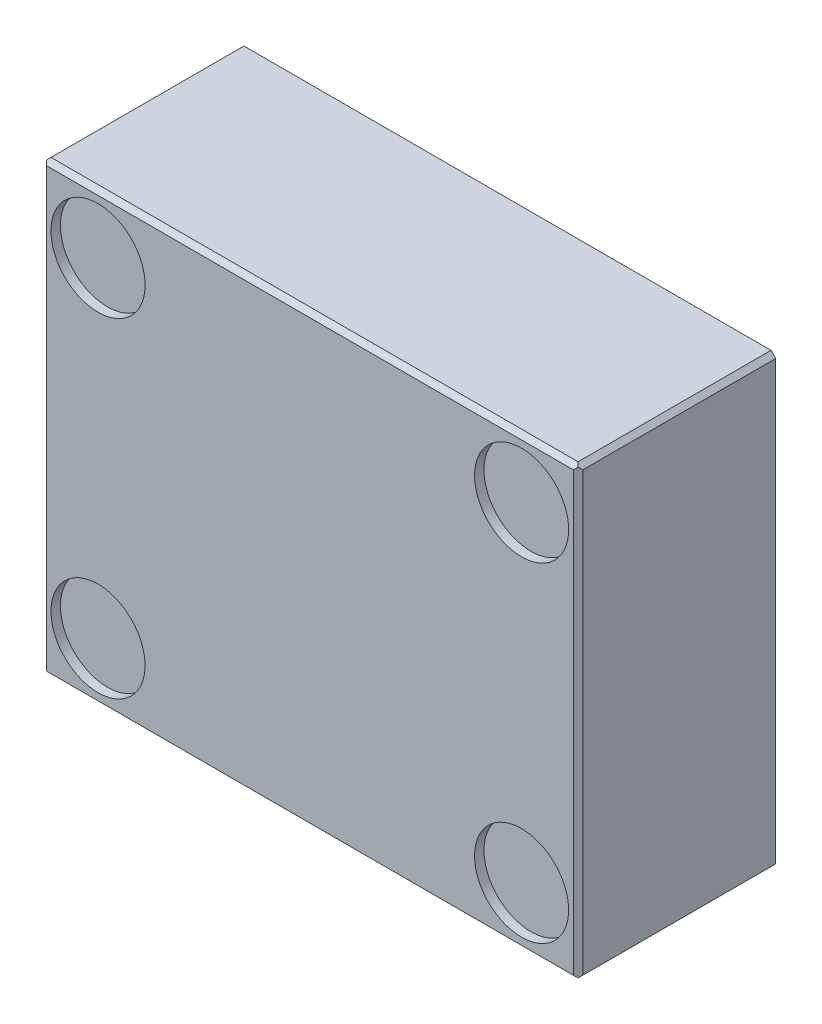
ISO-10303-21;
HEADER;
FILE_DESCRIPTION(('STEP AP214'),'2;1');
FILE_NAME('part.step','',(''),(''),'','','');
FILE_SCHEMA(('AUTOMOTIVE_DESIGN { 1 0 10303 214 1 1 1 1 }'));
ENDSEC;
DATA;
#1=APPLICATION_CONTEXT('core data for automotive mechanical design processes');
#2=APPLICATION_PROTOCOL_DEFINITION('international standard','automotive_design',2000,#1);
#3=PRODUCT_CONTEXT('',#1,'mechanical');
#4=PRODUCT('Part','Part','',(#3));
#5=PRODUCT_RELATED_PRODUCT_CATEGORY('part','',(#4));
#6=PRODUCT_DEFINITION_FORMATION('','',#4);
#7=PRODUCT_DEFINITION_CONTEXT('part definition',#1,'design');
#8=PRODUCT_DEFINITION('design','',#6,#7);
#9=PRODUCT_DEFINITION_SHAPE('','',#8);
#10=(LENGTH_UNIT() NAMED_UNIT(*) SI_UNIT(.MILLI.,.METRE.));
#11=(NAMED_UNIT(*) PLANE_ANGLE_UNIT() SI_UNIT($,.RADIAN.));
#12=(NAMED_UNIT(*) SI_UNIT($,.STERADIAN.) SOLID_ANGLE_UNIT());
#13=UNCERTAINTY_MEASURE_WITH_UNIT(LENGTH_MEASURE(1.E-05),#10,'distance_accuracy_value','');
#14=(GEOMETRIC_REPRESENTATION_CONTEXT(3) GLOBAL_UNCERTAINTY_ASSIGNED_CONTEXT((#13)) GLOBAL_UNIT_ASSIGNED_CONTEXT((#10,
#11,#12)) REPRESENTATION_CONTEXT('',''));
#15=CARTESIAN_POINT('',(0.,0.,0.));
#16=DIRECTION('',(0.,0.,1.));
#17=DIRECTION('',(1.,0.,0.));
#18=AXIS2_PLACEMENT_3D('',#15,#16,#17);
#19=CARTESIAN_POINT('',(-22.5,17.5,21.));
#20=DIRECTION('',(0.,0.,-1.));
#21=DIRECTION('',(-1.,0.,0.));
#22=AXIS2_PLACEMENT_3D('',#19,#20,#21);
#23=CYLINDRICAL_SURFACE('',#22,7.);
#24=DIRECTION('',(0.,0.,-1.));
#25=VECTOR('',#24,1.);
#26=CARTESIAN_POINT('',(-26.4999999999991,11.7554373534613,21.));
#27=LINE('',#26,#25);
#28=CARTESIAN_POINT('',(-26.4999999999995,11.7554373534616,19.));
#29=VERTEX_POINT('',#28);
#30=CARTESIAN_POINT('',(-26.4999999999995,11.7554373534616,18.));
#31=VERTEX_POINT('',#30);
#32=EDGE_CURVE('E188',#29,#31,#27,.T.);
#33=ORIENTED_EDGE('',*,*,#32,.T.);
#34=CARTESIAN_POINT('',(-22.5,17.5,18.));
#35=DIRECTION('',(0.,0.,-1.));
#36=DIRECTION('',(-1.,0.,0.));
#37=AXIS2_PLACEMENT_3D('',#34,#35,#36);
#38=CIRCLE('',#37,7.);
#39=CARTESIAN_POINT('',(-16.9378511346786,21.7500000000004,18.));
#40=VERTEX_POINT('',#39);
#41=EDGE_CURVE('E195',#40,#31,#38,.T.);
#42=ORIENTED_EDGE('',*,*,#41,.F.);
#43=DIRECTION('',(0.,0.,-1.));
#44=VECTOR('',#43,1.);
#45=CARTESIAN_POINT('',(-16.9378511346789,21.7500000000008,21.));
#46=LINE('',#45,#44);
#47=CARTESIAN_POINT('',(-16.9378511346786,21.7500000000004,19.));
#48=VERTEX_POINT('',#47);
#49=EDGE_CURVE('E232',#40,#48,#46,.F.);
#50=ORIENTED_EDGE('',*,*,#49,.T.);
#51=CARTESIAN_POINT('',(-22.5,17.5,19.));
#52=DIRECTION('',(0.,0.,-1.));
#53=DIRECTION('',(-1.,0.,0.));
#54=AXIS2_PLACEMENT_3D('',#51,#52,#53);
#55=CIRCLE('',#54,7.);
#56=EDGE_CURVE('E269',#48,#29,#55,.T.);
#57=ORIENTED_EDGE('',*,*,#56,.T.);
#58=EDGE_LOOP('',(#33,#42,#50,#57));
#59=FACE_BOUND('',#58,.T.);
#60=ADVANCED_FACE('F17',(#59),#23,.T.);
#61=CARTESIAN_POINT('',(-22.5,-17.5,21.));
#62=DIRECTION('',(0.,0.,-1.));
#63=DIRECTION('',(-1.,0.,0.));
#64=AXIS2_PLACEMENT_3D('',#61,#62,#63);
#65=CYLINDRICAL_SURFACE('',#64,7.);
#66=DIRECTION('',(0.,0.,-1.));
#67=VECTOR('',#66,1.);
#68=CARTESIAN_POINT('',(-16.9378511346789,-21.7500000000008,21.));
#69=LINE('',#68,#67);
#70=CARTESIAN_POINT('',(-16.9378511346786,-21.7500000000004,19.));
#71=VERTEX_POINT('',#70);
#72=CARTESIAN_POINT('',(-16.9378511346786,-21.7500000000004,18.));
#73=VERTEX_POINT('',#72);
#74=EDGE_CURVE('E187',#71,#73,#69,.T.);
#75=ORIENTED_EDGE('',*,*,#74,.T.);
#76=CARTESIAN_POINT('',(-22.5,-17.5,18.));
#77=DIRECTION('',(0.,0.,-1.));
#78=DIRECTION('',(-1.,0.,0.));
#79=AXIS2_PLACEMENT_3D('',#76,#77,#78);
#80=CIRCLE('',#79,7.);
#81=CARTESIAN_POINT('',(-26.4999999999995,-11.7554373534616,18.));
#82=VERTEX_POINT('',#81);
#83=EDGE_CURVE('E20',#82,#73,#80,.T.);
#84=ORIENTED_EDGE('',*,*,#83,.F.);
#85=DIRECTION('',(0.,0.,-1.));
#86=VECTOR('',#85,1.);
#87=CARTESIAN_POINT('',(-26.4999999999991,-11.7554373534613,21.));
#88=LINE('',#87,#86);
#89=CARTESIAN_POINT('',(-26.4999999999995,-11.7554373534616,19.));
#90=VERTEX_POINT('',#89);
#91=EDGE_CURVE('E175',#82,#90,#88,.F.);
#92=ORIENTED_EDGE('',*,*,#91,.T.);
#93=CARTESIAN_POINT('',(-22.5,-17.5,19.));
#94=DIRECTION('',(0.,0.,-1.));
#95=DIRECTION('',(-1.,0.,0.));
#96=AXIS2_PLACEMENT_3D('',#93,#94,#95);
#97=CIRCLE('',#96,7.);
#98=EDGE_CURVE('E267',#90,#71,#97,.T.);
#99=ORIENTED_EDGE('',*,*,#98,.T.);
#100=EDGE_LOOP('',(#75,#84,#92,#99));
#101=FACE_BOUND('',#100,.T.);
#102=ADVANCED_FACE('F192',(#101),#65,.T.);
#103=CARTESIAN_POINT('',(22.5,17.5,21.));
#104=DIRECTION('',(0.,0.,-1.));
#105=DIRECTION('',(-1.,0.,0.));
#106=AXIS2_PLACEMENT_3D('',#103,#104,#105);
#107=CYLINDRICAL_SURFACE('',#106,7.);
#108=DIRECTION('',(0.,0.,-1.));
#109=VECTOR('',#108,1.);
#110=CARTESIAN_POINT('',(26.4999999999991,11.7554373534613,21.));
#111=LINE('',#110,#109);
#112=CARTESIAN_POINT('',(26.4999999999995,11.7554373534617,18.));
#113=VERTEX_POINT('',#112);
#114=CARTESIAN_POINT('',(26.4999999999995,11.7554373534617,19.));
#115=VERTEX_POINT('',#114);
#116=EDGE_CURVE('E226',#113,#115,#111,.F.);
#117=ORIENTED_EDGE('',*,*,#116,.T.);
#118=CARTESIAN_POINT('',(22.5,17.5,19.));
#119=DIRECTION('',(0.,0.,-1.));
#120=DIRECTION('',(-1.,0.,0.));
#121=AXIS2_PLACEMENT_3D('',#118,#119,#120);
#122=CIRCLE('',#121,7.);
#123=CARTESIAN_POINT('',(16.9378511346786,21.7500000000004,19.));
#124=VERTEX_POINT('',#123);
#125=EDGE_CURVE('E261',#115,#124,#122,.T.);
#126=ORIENTED_EDGE('',*,*,#125,.T.);
#127=DIRECTION('',(0.,0.,-1.));
#128=VECTOR('',#127,1.);
#129=CARTESIAN_POINT('',(16.9378511346789,21.7500000000008,21.));
#130=LINE('',#129,#128);
#131=CARTESIAN_POINT('',(16.9378511346786,21.7500000000004,18.));
#132=VERTEX_POINT('',#131);
#133=EDGE_CURVE('E229',#124,#132,#130,.T.);
#134=ORIENTED_EDGE('',*,*,#133,.T.);
#135=CARTESIAN_POINT('',(22.5,17.5,18.));
#136=DIRECTION('',(0.,0.,-1.));
#137=DIRECTION('',(-1.,0.,0.));
#138=AXIS2_PLACEMENT_3D('',#135,#136,#137);
#139=CIRCLE('',#138,7.);
#140=EDGE_CURVE('E272',#113,#132,#139,.T.);
#141=ORIENTED_EDGE('',*,*,#140,.F.);
#142=EDGE_LOOP('',(#117,#126,#134,#141));
#143=FACE_BOUND('',#142,.T.);
#144=ADVANCED_FACE('F765',(#143),#107,.T.);
#145=CARTESIAN_POINT('',(22.5,-17.5,21.));
#146=DIRECTION('',(0.,0.,-1.));
#147=DIRECTION('',(-1.,0.,0.));
#148=AXIS2_PLACEMENT_3D('',#145,#146,#147);
#149=CYLINDRICAL_SURFACE('',#148,7.);
#150=DIRECTION('',(0.,0.,-1.));
#151=VECTOR('',#150,1.);
#152=CARTESIAN_POINT('',(16.9378511346789,-21.7500000000008,21.));
#153=LINE('',#152,#151);
#154=CARTESIAN_POINT('',(16.9378511346786,-21.7500000000004,18.));
#155=VERTEX_POINT('',#154);
#156=CARTESIAN_POINT('',(16.9378511346786,-21.7500000000004,19.));
#157=VERTEX_POINT('',#156);
#158=EDGE_CURVE('E196',#155,#157,#153,.F.);
#159=ORIENTED_EDGE('',*,*,#158,.T.);
#160=CARTESIAN_POINT('',(22.5,-17.5,19.));
#161=DIRECTION('',(0.,0.,-1.));
#162=DIRECTION('',(-1.,0.,0.));
#163=AXIS2_PLACEMENT_3D('',#160,#161,#162);
#164=CIRCLE('',#163,7.);
#165=CARTESIAN_POINT('',(26.4999999999995,-11.7554373534616,19.));
#166=VERTEX_POINT('',#165);
#167=EDGE_CURVE('E264',#157,#166,#164,.T.);
#168=ORIENTED_EDGE('',*,*,#167,.T.);
#169=DIRECTION('',(0.,0.,-1.));
#170=VECTOR('',#169,1.);
#171=CARTESIAN_POINT('',(26.4999999999991,-11.7554373534613,21.));
#172=LINE('',#171,#170);
#173=CARTESIAN_POINT('',(26.4999999999995,-11.7554373534616,18.));
#174=VERTEX_POINT('',#173);
#175=EDGE_CURVE('E224',#166,#174,#172,.T.);
#176=ORIENTED_EDGE('',*,*,#175,.T.);
#177=CARTESIAN_POINT('',(22.5,-17.5,18.));
#178=DIRECTION('',(0.,0.,-1.));
#179=DIRECTION('',(-1.,0.,0.));
#180=AXIS2_PLACEMENT_3D('',#177,#178,#179);
#181=CIRCLE('',#180,7.);
#182=EDGE_CURVE('E258',#155,#174,#181,.T.);
#183=ORIENTED_EDGE('',*,*,#182,.F.);
#184=EDGE_LOOP('',(#159,#168,#176,#183));
#185=FACE_BOUND('',#184,.T.);
#186=ADVANCED_FACE('F757',(#185),#149,.T.);
#187=CARTESIAN_POINT('',(-22.5,-17.5,18.));
#188=DIRECTION('',(0.,0.,-1.));
#189=DIRECTION('',(-1.,0.,0.));
#190=AXIS2_PLACEMENT_3D('',#187,#188,#189);
#191=PLANE('',#190);
#192=ORIENTED_EDGE('',*,*,#83,.T.);
#193=DIRECTION('',(1.,0.,0.));
#194=VECTOR('',#193,1.);
#195=CARTESIAN_POINT('',(-28.5,-21.75,18.));
#196=LINE('',#195,#194);
#197=CARTESIAN_POINT('',(-26.5,-21.75,18.));
#198=VERTEX_POINT('',#197);
#199=EDGE_CURVE('E198',#73,#198,#196,.F.);
#200=ORIENTED_EDGE('',*,*,#199,.T.);
#201=DIRECTION('',(0.,1.,0.));
#202=VECTOR('',#201,1.);
#203=CARTESIAN_POINT('',(-26.5,23.75,18.));
#204=LINE('',#203,#202);
#205=EDGE_CURVE('E181',#198,#82,#204,.T.);
#206=ORIENTED_EDGE('',*,*,#205,.T.);
#207=EDGE_LOOP('',(#192,#200,#206));
#208=FACE_BOUND('',#207,.T.);
#209=ADVANCED_FACE('F197',(#208),#191,.T.);
#210=CARTESIAN_POINT('',(-22.5,17.5,18.));
#211=DIRECTION('',(0.,0.,-1.));
#212=DIRECTION('',(-1.,0.,0.));
#213=AXIS2_PLACEMENT_3D('',#210,#211,#212);
#214=PLANE('',#213);
#215=ORIENTED_EDGE('',*,*,#41,.T.);
#216=DIRECTION('',(0.,1.,0.));
#217=VECTOR('',#216,1.);
#218=CARTESIAN_POINT('',(-26.5,23.75,18.));
#219=LINE('',#218,#217);
#220=CARTESIAN_POINT('',(-26.5,21.75,18.));
#221=VERTEX_POINT('',#220);
#222=EDGE_CURVE('E202',#31,#221,#219,.T.);
#223=ORIENTED_EDGE('',*,*,#222,.T.);
#224=DIRECTION('',(1.,0.,0.));
#225=VECTOR('',#224,1.);
#226=CARTESIAN_POINT('',(28.5,21.75,18.));
#227=LINE('',#226,#225);
#228=EDGE_CURVE('E281',#221,#40,#227,.T.);
#229=ORIENTED_EDGE('',*,*,#228,.T.);
#230=EDGE_LOOP('',(#215,#223,#229));
#231=FACE_BOUND('',#230,.T.);
#232=ADVANCED_FACE('F278',(#231),#214,.T.);
#233=CARTESIAN_POINT('',(22.5,17.5,18.));
#234=DIRECTION('',(0.,0.,-1.));
#235=DIRECTION('',(-1.,0.,0.));
#236=AXIS2_PLACEMENT_3D('',#233,#234,#235);
#237=PLANE('',#236);
#238=ORIENTED_EDGE('',*,*,#140,.T.);
#239=DIRECTION('',(1.,0.,0.));
#240=VECTOR('',#239,1.);
#241=CARTESIAN_POINT('',(28.5,21.75,18.));
#242=LINE('',#241,#240);
#243=CARTESIAN_POINT('',(26.5,21.75,18.));
#244=VERTEX_POINT('',#243);
#245=EDGE_CURVE('E315',#132,#244,#242,.T.);
#246=ORIENTED_EDGE('',*,*,#245,.T.);
#247=DIRECTION('',(0.,1.,0.));
#248=VECTOR('',#247,1.);
#249=CARTESIAN_POINT('',(26.5,-23.75,18.));
#250=LINE('',#249,#248);
#251=EDGE_CURVE('E326',#244,#113,#250,.F.);
#252=ORIENTED_EDGE('',*,*,#251,.T.);
#253=EDGE_LOOP('',(#238,#246,#252));
#254=FACE_BOUND('',#253,.T.);
#255=ADVANCED_FACE('F735',(#254),#237,.T.);
#256=CARTESIAN_POINT('',(0.,0.,19.));
#257=DIRECTION('',(0.,0.,1.));
#258=DIRECTION('',(1.,0.,0.));
#259=AXIS2_PLACEMENT_3D('',#256,#257,#258);
#260=PLANE('',#259);
#261=DIRECTION('',(0.,1.,0.));
#262=VECTOR('',#261,1.);
#263=CARTESIAN_POINT('',(26.5,-23.75,19.));
#264=LINE('',#263,#262);
#265=EDGE_CURVE('E334',#115,#166,#264,.F.);
#266=ORIENTED_EDGE('',*,*,#265,.T.);
#267=ORIENTED_EDGE('',*,*,#167,.F.);
#268=DIRECTION('',(1.,0.,0.));
#269=VECTOR('',#268,1.);
#270=CARTESIAN_POINT('',(-28.5,-21.75,19.));
#271=LINE('',#270,#269);
#272=EDGE_CURVE('E212',#157,#71,#271,.F.);
#273=ORIENTED_EDGE('',*,*,#272,.T.);
#274=ORIENTED_EDGE('',*,*,#98,.F.);
#275=DIRECTION('',(0.,1.,0.));
#276=VECTOR('',#275,1.);
#277=CARTESIAN_POINT('',(-26.5,23.75,19.));
#278=LINE('',#277,#276);
#279=EDGE_CURVE('E183',#90,#29,#278,.T.);
#280=ORIENTED_EDGE('',*,*,#279,.T.);
#281=ORIENTED_EDGE('',*,*,#56,.F.);
#282=DIRECTION('',(1.,0.,0.));
#283=VECTOR('',#282,1.);
#284=CARTESIAN_POINT('',(28.5,21.75,19.));
#285=LINE('',#284,#283);
#286=EDGE_CURVE('E312',#48,#124,#285,.T.);
#287=ORIENTED_EDGE('',*,*,#286,.T.);
#288=ORIENTED_EDGE('',*,*,#125,.F.);
#289=EDGE_LOOP('',(#266,#267,#273,#274,#280,#281,#287,#288));
#290=FACE_BOUND('',#289,.T.);
#291=ADVANCED_FACE('F726',(#290),#260,.F.);
#292=CARTESIAN_POINT('',(22.5,-17.5,18.));
#293=DIRECTION('',(0.,0.,-1.));
#294=DIRECTION('',(-1.,0.,0.));
#295=AXIS2_PLACEMENT_3D('',#292,#293,#294);
#296=PLANE('',#295);
#297=ORIENTED_EDGE('',*,*,#182,.T.);
#298=DIRECTION('',(0.,1.,0.));
#299=VECTOR('',#298,1.);
#300=CARTESIAN_POINT('',(26.5,-23.75,18.));
#301=LINE('',#300,#299);
#302=CARTESIAN_POINT('',(26.5,-21.75,18.));
#303=VERTEX_POINT('',#302);
#304=EDGE_CURVE('E337',#174,#303,#301,.F.);
#305=ORIENTED_EDGE('',*,*,#304,.T.);
#306=DIRECTION('',(1.,0.,0.));
#307=VECTOR('',#306,1.);
#308=CARTESIAN_POINT('',(-28.5,-21.75,18.));
#309=LINE('',#308,#307);
#310=EDGE_CURVE('E223',#303,#155,#309,.F.);
#311=ORIENTED_EDGE('',*,*,#310,.T.);
#312=EDGE_LOOP('',(#297,#305,#311));
#313=FACE_BOUND('',#312,.T.);
#314=ADVANCED_FACE('F717',(#313),#296,.T.);
#315=CARTESIAN_POINT('',(-28.5,-21.75,0.));
#316=DIRECTION('',(0.,-1.,0.));
#317=DIRECTION('',(0.,0.,-1.));
#318=AXIS2_PLACEMENT_3D('',#315,#316,#317);
#319=PLANE('',#318);
#320=ORIENTED_EDGE('',*,*,#199,.F.);
#321=ORIENTED_EDGE('',*,*,#74,.F.);
#322=ORIENTED_EDGE('',*,*,#272,.F.);
#323=ORIENTED_EDGE('',*,*,#158,.F.);
#324=ORIENTED_EDGE('',*,*,#310,.F.);
#325=DIRECTION('',(0.,0.,-1.));
#326=VECTOR('',#325,1.);
#327=CARTESIAN_POINT('',(26.5,-21.75,0.));
#328=LINE('',#327,#326);
#329=CARTESIAN_POINT('',(26.5,-21.75,0.));
#330=VERTEX_POINT('',#329);
#331=EDGE_CURVE('E340',#303,#330,#328,.T.);
#332=ORIENTED_EDGE('',*,*,#331,.T.);
#333=DIRECTION('',(1.,0.,0.));
#334=VECTOR('',#333,1.);
#335=CARTESIAN_POINT('',(0.,-21.75,0.));
#336=LINE('',#335,#334);
#337=CARTESIAN_POINT('',(-26.5,-21.75,0.));
#338=VERTEX_POINT('',#337);
#339=EDGE_CURVE('E215',#330,#338,#336,.F.);
#340=ORIENTED_EDGE('',*,*,#339,.T.);
#341=DIRECTION('',(0.,0.,1.));
#342=VECTOR('',#341,1.);
#343=CARTESIAN_POINT('',(-26.5,-21.75,0.));
#344=LINE('',#343,#342);
#345=EDGE_CURVE('E200',#338,#198,#344,.T.);
#346=ORIENTED_EDGE('',*,*,#345,.T.);
#347=EDGE_LOOP('',(#320,#321,#322,#323,#324,#332,#340,#346));
#348=FACE_BOUND('',#347,.T.);
#349=ADVANCED_FACE('F709',(#348),#319,.F.);
#350=CARTESIAN_POINT('',(-26.5,23.75,0.));
#351=DIRECTION('',(-1.,0.,0.));
#352=DIRECTION('',(0.,0.,1.));
#353=AXIS2_PLACEMENT_3D('',#350,#351,#352);
#354=PLANE('',#353);
#355=ORIENTED_EDGE('',*,*,#222,.F.);
#356=ORIENTED_EDGE('',*,*,#32,.F.);
#357=ORIENTED_EDGE('',*,*,#279,.F.);
#358=ORIENTED_EDGE('',*,*,#91,.F.);
#359=ORIENTED_EDGE('',*,*,#205,.F.);
#360=ORIENTED_EDGE('',*,*,#345,.F.);
#361=DIRECTION('',(0.,1.,0.));
#362=VECTOR('',#361,1.);
#363=CARTESIAN_POINT('',(-26.5,0.,0.));
#364=LINE('',#363,#362);
#365=CARTESIAN_POINT('',(-26.5,21.75,0.));
#366=VERTEX_POINT('',#365);
#367=EDGE_CURVE('E217',#338,#366,#364,.T.);
#368=ORIENTED_EDGE('',*,*,#367,.T.);
#369=DIRECTION('',(0.,0.,1.));
#370=VECTOR('',#369,1.);
#371=CARTESIAN_POINT('',(-26.5,21.75,0.));
#372=LINE('',#371,#370);
#373=EDGE_CURVE('E284',#366,#221,#372,.T.);
#374=ORIENTED_EDGE('',*,*,#373,.T.);
#375=EDGE_LOOP('',(#355,#356,#357,#358,#359,#360,#368,#374));
#376=FACE_BOUND('',#375,.T.);
#377=ADVANCED_FACE('F178',(#376),#354,.F.);
#378=CARTESIAN_POINT('',(28.5,21.75,0.));
#379=DIRECTION('',(0.,1.,0.));
#380=DIRECTION('',(0.,0.,1.));
#381=AXIS2_PLACEMENT_3D('',#378,#379,#380);
#382=PLANE('',#381);
#383=ORIENTED_EDGE('',*,*,#245,.F.);
#384=ORIENTED_EDGE('',*,*,#133,.F.);
#385=ORIENTED_EDGE('',*,*,#286,.F.);
#386=ORIENTED_EDGE('',*,*,#49,.F.);
#387=ORIENTED_EDGE('',*,*,#228,.F.);
#388=ORIENTED_EDGE('',*,*,#373,.F.);
#389=DIRECTION('',(1.,0.,0.));
#390=VECTOR('',#389,1.);
#391=CARTESIAN_POINT('',(0.,21.75,0.));
#392=LINE('',#391,#390);
#393=CARTESIAN_POINT('',(26.5,21.75,0.));
#394=VERTEX_POINT('',#393);
#395=EDGE_CURVE('E292',#366,#394,#392,.T.);
#396=ORIENTED_EDGE('',*,*,#395,.T.);
#397=DIRECTION('',(0.,0.,-1.));
#398=VECTOR('',#397,1.);
#399=CARTESIAN_POINT('',(26.5,21.75,0.));
#400=LINE('',#399,#398);
#401=EDGE_CURVE('E322',#394,#244,#400,.F.);
#402=ORIENTED_EDGE('',*,*,#401,.T.);
#403=EDGE_LOOP('',(#383,#384,#385,#386,#387,#388,#396,#402));
#404=FACE_BOUND('',#403,.T.);
#405=ADVANCED_FACE('F693',(#404),#382,.F.);
#406=CARTESIAN_POINT('',(26.5,-23.75,0.));
#407=DIRECTION('',(1.,0.,0.));
#408=DIRECTION('',(0.,0.,-1.));
#409=AXIS2_PLACEMENT_3D('',#406,#407,#408);
#410=PLANE('',#409);
#411=ORIENTED_EDGE('',*,*,#304,.F.);
#412=ORIENTED_EDGE('',*,*,#175,.F.);
#413=ORIENTED_EDGE('',*,*,#265,.F.);
#414=ORIENTED_EDGE('',*,*,#116,.F.);
#415=ORIENTED_EDGE('',*,*,#251,.F.);
#416=ORIENTED_EDGE('',*,*,#401,.F.);
#417=DIRECTION('',(0.,1.,0.));
#418=VECTOR('',#417,1.);
#419=CARTESIAN_POINT('',(26.5,0.,0.));
#420=LINE('',#419,#418);
#421=EDGE_CURVE('E295',#394,#330,#420,.F.);
#422=ORIENTED_EDGE('',*,*,#421,.T.);
#423=ORIENTED_EDGE('',*,*,#331,.F.);
#424=EDGE_LOOP('',(#411,#412,#413,#414,#415,#416,#422,#423));
#425=FACE_BOUND('',#424,.T.);
#426=ADVANCED_FACE('F685',(#425),#410,.F.);
#427=CARTESIAN_POINT('',(-28.25,-23.5,10.5));
#428=DIRECTION('',(-0.707106781186548,-0.707106781186548,0.));
#429=DIRECTION('',(0.707106781186548,-0.707106781186548,0.));
#430=AXIS2_PLACEMENT_3D('',#427,#428,#429);
#431=PLANE('',#430);
#432=DIRECTION('',(0.,0.,1.));
#433=VECTOR('',#432,1.);
#434=CARTESIAN_POINT('',(-28.5,-23.25,0.));
#435=LINE('',#434,#433);
#436=CARTESIAN_POINT('',(-28.5,-23.25,0.));
#437=VERTEX_POINT('',#436);
#438=CARTESIAN_POINT('',(-28.5,-23.25,20.5));
#439=VERTEX_POINT('',#438);
#440=EDGE_CURVE('E379',#437,#439,#435,.T.);
#441=ORIENTED_EDGE('',*,*,#440,.F.);
#442=DIRECTION('',(0.707106781186547,-0.707106781186547,0.));
#443=VECTOR('',#442,1.);
#444=CARTESIAN_POINT('',(-28.5,-23.25,0.));
#445=LINE('',#444,#443);
#446=CARTESIAN_POINT('',(-28.,-23.75,0.));
#447=VERTEX_POINT('',#446);
#448=EDGE_CURVE('E364',#437,#447,#445,.T.);
#449=ORIENTED_EDGE('',*,*,#448,.T.);
#450=DIRECTION('',(0.,0.,-1.));
#451=VECTOR('',#450,1.);
#452=CARTESIAN_POINT('',(-28.,-23.75,0.));
#453=LINE('',#452,#451);
#454=CARTESIAN_POINT('',(-28.,-23.75,20.5));
#455=VERTEX_POINT('',#454);
#456=EDGE_CURVE('E385',#455,#447,#453,.T.);
#457=ORIENTED_EDGE('',*,*,#456,.F.);
#458=DIRECTION('',(-0.577350269189626,0.577350269189626,0.577350269189626));
#459=VECTOR('',#458,1.);
#460=CARTESIAN_POINT('',(-28.,-23.75,20.5));
#461=LINE('',#460,#459);
#462=CARTESIAN_POINT('',(-28.25,-23.5,20.75));
#463=VERTEX_POINT('',#462);
#464=EDGE_CURVE('E342',#455,#463,#461,.T.);
#465=ORIENTED_EDGE('',*,*,#464,.T.);
#466=DIRECTION('',(-0.577350269189626,0.577350269189626,-0.577350269189626));
#467=VECTOR('',#466,1.);
#468=CARTESIAN_POINT('',(-28.25,-23.5,20.75));
#469=LINE('',#468,#467);
#470=EDGE_CURVE('E352',#463,#439,#469,.T.);
#471=ORIENTED_EDGE('',*,*,#470,.T.);
#472=EDGE_LOOP('',(#441,#449,#457,#465,#471));
#473=FACE_BOUND('',#472,.T.);
#474=ADVANCED_FACE('F462',(#473),#431,.T.);
#475=CARTESIAN_POINT('',(28.25,-23.5,10.5));
#476=DIRECTION('',(0.707106781186548,-0.707106781186548,0.));
#477=DIRECTION('',(0.707106781186548,0.707106781186548,0.));
#478=AXIS2_PLACEMENT_3D('',#475,#476,#477);
#479=PLANE('',#478);
#480=DIRECTION('',(0.,0.,-1.));
#481=VECTOR('',#480,1.);
#482=CARTESIAN_POINT('',(28.,-23.75,0.));
#483=LINE('',#482,#481);
#484=CARTESIAN_POINT('',(28.,-23.75,0.));
#485=VERTEX_POINT('',#484);
#486=CARTESIAN_POINT('',(28.,-23.75,20.5));
#487=VERTEX_POINT('',#486);
#488=EDGE_CURVE('E391',#485,#487,#483,.F.);
#489=ORIENTED_EDGE('',*,*,#488,.F.);
#490=DIRECTION('',(0.707106781186547,0.707106781186547,0.));
#491=VECTOR('',#490,1.);
#492=CARTESIAN_POINT('',(28.,-23.75,0.));
#493=LINE('',#492,#491);
#494=CARTESIAN_POINT('',(28.5,-23.25,0.));
#495=VERTEX_POINT('',#494);
#496=EDGE_CURVE('E366',#485,#495,#493,.T.);
#497=ORIENTED_EDGE('',*,*,#496,.T.);
#498=DIRECTION('',(0.,0.,-1.));
#499=VECTOR('',#498,1.);
#500=CARTESIAN_POINT('',(28.5,-23.25,0.));
#501=LINE('',#500,#499);
#502=CARTESIAN_POINT('',(28.5,-23.25,20.5));
#503=VERTEX_POINT('',#502);
#504=EDGE_CURVE('E394',#503,#495,#501,.T.);
#505=ORIENTED_EDGE('',*,*,#504,.F.);
#506=DIRECTION('',(-0.577350269189626,-0.577350269189626,0.577350269189626));
#507=VECTOR('',#506,1.);
#508=CARTESIAN_POINT('',(28.5,-23.25,20.5));
#509=LINE('',#508,#507);
#510=CARTESIAN_POINT('',(28.25,-23.5,20.75));
#511=VERTEX_POINT('',#510);
#512=EDGE_CURVE('E354',#503,#511,#509,.T.);
#513=ORIENTED_EDGE('',*,*,#512,.T.);
#514=DIRECTION('',(-0.577350269189626,-0.577350269189626,-0.577350269189626));
#515=VECTOR('',#514,1.);
#516=CARTESIAN_POINT('',(28.25,-23.5,20.75));
#517=LINE('',#516,#515);
#518=EDGE_CURVE('E357',#511,#487,#517,.T.);
#519=ORIENTED_EDGE('',*,*,#518,.T.);
#520=EDGE_LOOP('',(#489,#497,#505,#513,#519));
#521=FACE_BOUND('',#520,.T.);
#522=ADVANCED_FACE('F471',(#521),#479,.T.);
#523=CARTESIAN_POINT('',(28.25,23.5,10.5));
#524=DIRECTION('',(0.707106781186548,0.707106781186548,0.));
#525=DIRECTION('',(-0.707106781186548,0.707106781186548,0.));
#526=AXIS2_PLACEMENT_3D('',#523,#524,#525);
#527=PLANE('',#526);
#528=DIRECTION('',(0.,0.,-1.));
#529=VECTOR('',#528,1.);
#530=CARTESIAN_POINT('',(28.5,23.25,0.));
#531=LINE('',#530,#529);
#532=CARTESIAN_POINT('',(28.5,23.25,0.));
#533=VERTEX_POINT('',#532);
#534=CARTESIAN_POINT('',(28.5,23.25,20.5));
#535=VERTEX_POINT('',#534);
#536=EDGE_CURVE('E400',#533,#535,#531,.F.);
#537=ORIENTED_EDGE('',*,*,#536,.F.);
#538=DIRECTION('',(-0.707106781186547,0.707106781186547,0.));
#539=VECTOR('',#538,1.);
#540=CARTESIAN_POINT('',(28.5,23.25,0.));
#541=LINE('',#540,#539);
#542=CARTESIAN_POINT('',(28.,23.75,0.));
#543=VERTEX_POINT('',#542);
#544=EDGE_CURVE('E218',#533,#543,#541,.T.);
#545=ORIENTED_EDGE('',*,*,#544,.T.);
#546=DIRECTION('',(0.,0.,1.));
#547=VECTOR('',#546,1.);
#548=CARTESIAN_POINT('',(28.,23.75,0.));
#549=LINE('',#548,#547);
#550=CARTESIAN_POINT('',(28.,23.75,20.5));
#551=VERTEX_POINT('',#550);
#552=EDGE_CURVE('E403',#551,#543,#549,.F.);
#553=ORIENTED_EDGE('',*,*,#552,.F.);
#554=DIRECTION('',(0.577350269189626,-0.577350269189626,0.577350269189626));
#555=VECTOR('',#554,1.);
#556=CARTESIAN_POINT('',(28.,23.75,20.5));
#557=LINE('',#556,#555);
#558=CARTESIAN_POINT('',(28.25,23.5,20.75));
#559=VERTEX_POINT('',#558);
#560=EDGE_CURVE('E359',#551,#559,#557,.T.);
#561=ORIENTED_EDGE('',*,*,#560,.T.);
#562=DIRECTION('',(0.577350269189626,-0.577350269189626,-0.577350269189626));
#563=VECTOR('',#562,1.);
#564=CARTESIAN_POINT('',(28.25,23.5,20.75));
#565=LINE('',#564,#563);
#566=EDGE_CURVE('E362',#559,#535,#565,.T.);
#567=ORIENTED_EDGE('',*,*,#566,.T.);
#568=EDGE_LOOP('',(#537,#545,#553,#561,#567));
#569=FACE_BOUND('',#568,.T.);
#570=ADVANCED_FACE('F478',(#569),#527,.T.);
#571=CARTESIAN_POINT('',(0.,0.,0.));
#572=DIRECTION('',(0.,0.,1.));
#573=DIRECTION('',(1.,0.,0.));
#574=AXIS2_PLACEMENT_3D('',#571,#572,#573);
#575=PLANE('',#574);
#576=ORIENTED_EDGE('',*,*,#395,.F.);
#577=ORIENTED_EDGE('',*,*,#367,.F.);
#578=ORIENTED_EDGE('',*,*,#339,.F.);
#579=ORIENTED_EDGE('',*,*,#421,.F.);
#580=EDGE_LOOP('',(#576,#577,#578,#579));
#581=FACE_BOUND('',#580,.T.);
#582=ORIENTED_EDGE('',*,*,#544,.F.);
#583=DIRECTION('',(0.,1.,0.));
#584=VECTOR('',#583,1.);
#585=CARTESIAN_POINT('',(28.5,-23.75,0.));
#586=LINE('',#585,#584);
#587=EDGE_CURVE('E397',#495,#533,#586,.T.);
#588=ORIENTED_EDGE('',*,*,#587,.F.);
#589=ORIENTED_EDGE('',*,*,#496,.F.);
#590=DIRECTION('',(1.,0.,0.));
#591=VECTOR('',#590,1.);
#592=CARTESIAN_POINT('',(-28.5,-23.75,0.));
#593=LINE('',#592,#591);
#594=EDGE_CURVE('E388',#447,#485,#593,.T.);
#595=ORIENTED_EDGE('',*,*,#594,.F.);
#596=ORIENTED_EDGE('',*,*,#448,.F.);
#597=DIRECTION('',(0.,1.,0.));
#598=VECTOR('',#597,1.);
#599=CARTESIAN_POINT('',(-28.5,23.75,0.));
#600=LINE('',#599,#598);
#601=CARTESIAN_POINT('',(-28.5,23.25,0.));
#602=VERTEX_POINT('',#601);
#603=EDGE_CURVE('E376',#602,#437,#600,.F.);
#604=ORIENTED_EDGE('',*,*,#603,.F.);
#605=DIRECTION('',(-0.707106781186548,-0.707106781186548,0.));
#606=VECTOR('',#605,1.);
#607=CARTESIAN_POINT('',(-28.25,23.5,0.));
#608=LINE('',#607,#606);
#609=CARTESIAN_POINT('',(-28.,23.75,0.));
#610=VERTEX_POINT('',#609);
#611=EDGE_CURVE('E373',#610,#602,#608,.T.);
#612=ORIENTED_EDGE('',*,*,#611,.F.);
#613=DIRECTION('',(1.,0.,0.));
#614=VECTOR('',#613,1.);
#615=CARTESIAN_POINT('',(28.5,23.75,0.));
#616=LINE('',#615,#614);
#617=EDGE_CURVE('E406',#543,#610,#616,.F.);
#618=ORIENTED_EDGE('',*,*,#617,.F.);
#619=EDGE_LOOP('',(#582,#588,#589,#595,#596,#604,#612,#618));
#620=FACE_BOUND('',#619,.T.);
#621=ADVANCED_FACE('F485',(#581,#620),#575,.F.);
#622=CARTESIAN_POINT('',(-28.25,23.5,10.5));
#623=DIRECTION('',(-0.707106781186548,0.707106781186548,0.));
#624=DIRECTION('',(-0.707106781186548,-0.707106781186548,0.));
#625=AXIS2_PLACEMENT_3D('',#622,#623,#624);
#626=PLANE('',#625);
#627=DIRECTION('',(0.,0.,1.));
#628=VECTOR('',#627,1.);
#629=CARTESIAN_POINT('',(-28.,23.75,0.));
#630=LINE('',#629,#628);
#631=CARTESIAN_POINT('',(-28.,23.75,20.5));
#632=VERTEX_POINT('',#631);
#633=EDGE_CURVE('E409',#610,#632,#630,.T.);
#634=ORIENTED_EDGE('',*,*,#633,.F.);
#635=ORIENTED_EDGE('',*,*,#611,.T.);
#636=DIRECTION('',(0.,0.,1.));
#637=VECTOR('',#636,1.);
#638=CARTESIAN_POINT('',(-28.5,23.25,0.));
#639=LINE('',#638,#637);
#640=CARTESIAN_POINT('',(-28.5,23.25,20.5));
#641=VERTEX_POINT('',#640);
#642=EDGE_CURVE('E382',#641,#602,#639,.F.);
#643=ORIENTED_EDGE('',*,*,#642,.F.);
#644=DIRECTION('',(0.577350269189626,0.577350269189626,0.577350269189626));
#645=VECTOR('',#644,1.);
#646=CARTESIAN_POINT('',(-28.5,23.25,20.5));
#647=LINE('',#646,#645);
#648=CARTESIAN_POINT('',(-28.25,23.5,20.75));
#649=VERTEX_POINT('',#648);
#650=EDGE_CURVE('E302',#641,#649,#647,.T.);
#651=ORIENTED_EDGE('',*,*,#650,.T.);
#652=DIRECTION('',(0.577350269189626,0.577350269189626,-0.577350269189626));
#653=VECTOR('',#652,1.);
#654=CARTESIAN_POINT('',(-28.25,23.5,20.75));
#655=LINE('',#654,#653);
#656=EDGE_CURVE('E371',#649,#632,#655,.T.);
#657=ORIENTED_EDGE('',*,*,#656,.T.);
#658=EDGE_LOOP('',(#634,#635,#643,#651,#657));
#659=FACE_BOUND('',#658,.T.);
#660=ADVANCED_FACE('F452',(#659),#626,.T.);
#661=CARTESIAN_POINT('',(-28.5,23.75,0.));
#662=DIRECTION('',(-1.,0.,0.));
#663=DIRECTION('',(0.,0.,1.));
#664=AXIS2_PLACEMENT_3D('',#661,#662,#663);
#665=PLANE('',#664);
#666=DIRECTION('',(0.,1.,0.));
#667=VECTOR('',#666,1.);
#668=CARTESIAN_POINT('',(-28.5,0.,20.5));
#669=LINE('',#668,#667);
#670=EDGE_CURVE('E412',#641,#439,#669,.F.);
#671=ORIENTED_EDGE('',*,*,#670,.F.);
#672=ORIENTED_EDGE('',*,*,#642,.T.);
#673=ORIENTED_EDGE('',*,*,#603,.T.);
#674=ORIENTED_EDGE('',*,*,#440,.T.);
#675=EDGE_LOOP('',(#671,#672,#673,#674));
#676=FACE_BOUND('',#675,.T.);
#677=ADVANCED_FACE('F455',(#676),#665,.T.);
#678=CARTESIAN_POINT('',(-28.5,-23.75,0.));
#679=DIRECTION('',(0.,-1.,0.));
#680=DIRECTION('',(0.,0.,-1.));
#681=AXIS2_PLACEMENT_3D('',#678,#679,#680);
#682=PLANE('',#681);
#683=ORIENTED_EDGE('',*,*,#594,.T.);
#684=ORIENTED_EDGE('',*,*,#488,.T.);
#685=DIRECTION('',(1.,0.,0.));
#686=VECTOR('',#685,1.);
#687=CARTESIAN_POINT('',(0.,-23.75,20.5));
#688=LINE('',#687,#686);
#689=EDGE_CURVE('E418',#455,#487,#688,.T.);
#690=ORIENTED_EDGE('',*,*,#689,.F.);
#691=ORIENTED_EDGE('',*,*,#456,.T.);
#692=EDGE_LOOP('',(#683,#684,#690,#691));
#693=FACE_BOUND('',#692,.T.);
#694=ADVANCED_FACE('F466',(#693),#682,.T.);
#695=CARTESIAN_POINT('',(28.5,-23.75,0.));
#696=DIRECTION('',(1.,0.,0.));
#697=DIRECTION('',(0.,0.,-1.));
#698=AXIS2_PLACEMENT_3D('',#695,#696,#697);
#699=PLANE('',#698);
#700=ORIENTED_EDGE('',*,*,#587,.T.);
#701=ORIENTED_EDGE('',*,*,#536,.T.);
#702=DIRECTION('',(0.,1.,0.));
#703=VECTOR('',#702,1.);
#704=CARTESIAN_POINT('',(28.5,0.,20.5));
#705=LINE('',#704,#703);
#706=EDGE_CURVE('E424',#503,#535,#705,.T.);
#707=ORIENTED_EDGE('',*,*,#706,.F.);
#708=ORIENTED_EDGE('',*,*,#504,.T.);
#709=EDGE_LOOP('',(#700,#701,#707,#708));
#710=FACE_BOUND('',#709,.T.);
#711=ADVANCED_FACE('F475',(#710),#699,.T.);
#712=CARTESIAN_POINT('',(28.5,23.75,0.));
#713=DIRECTION('',(0.,1.,0.));
#714=DIRECTION('',(0.,0.,1.));
#715=AXIS2_PLACEMENT_3D('',#712,#713,#714);
#716=PLANE('',#715);
#717=ORIENTED_EDGE('',*,*,#617,.T.);
#718=ORIENTED_EDGE('',*,*,#633,.T.);
#719=DIRECTION('',(1.,0.,0.));
#720=VECTOR('',#719,1.);
#721=CARTESIAN_POINT('',(0.,23.75,20.5));
#722=LINE('',#721,#720);
#723=EDGE_CURVE('E257',#551,#632,#722,.F.);
#724=ORIENTED_EDGE('',*,*,#723,.F.);
#725=ORIENTED_EDGE('',*,*,#552,.T.);
#726=EDGE_LOOP('',(#717,#718,#724,#725));
#727=FACE_BOUND('',#726,.T.);
#728=ADVANCED_FACE('F482',(#727),#716,.T.);
#729=CARTESIAN_POINT('',(-22.5,17.5,20.));
#730=DIRECTION('',(0.,0.,-1.));
#731=DIRECTION('',(-1.,0.,0.));
#732=AXIS2_PLACEMENT_3D('',#729,#730,#731);
#733=PLANE('',#732);
#734=CARTESIAN_POINT('',(-22.5,17.5,20.));
#735=DIRECTION('',(0.,0.,-1.));
#736=DIRECTION('',(-1.,0.,0.));
#737=AXIS2_PLACEMENT_3D('',#734,#735,#736);
#738=CIRCLE('',#737,5.);
#739=CARTESIAN_POINT('',(-27.5,17.5,20.));
#740=VERTEX_POINT('',#739);
#741=EDGE_CURVE('E254',#740,#740,#738,.F.);
#742=ORIENTED_EDGE('',*,*,#741,.T.);
#743=EDGE_LOOP('',(#742));
#744=FACE_BOUND('',#743,.T.);
#745=ADVANCED_FACE('F538',(#744),#733,.F.);
#746=CARTESIAN_POINT('',(22.5,17.5,20.));
#747=DIRECTION('',(0.,0.,-1.));
#748=DIRECTION('',(-1.,0.,0.));
#749=AXIS2_PLACEMENT_3D('',#746,#747,#748);
#750=PLANE('',#749);
#751=CARTESIAN_POINT('',(22.5,17.5,20.));
#752=DIRECTION('',(0.,0.,-1.));
#753=DIRECTION('',(-1.,0.,0.));
#754=AXIS2_PLACEMENT_3D('',#751,#752,#753);
#755=CIRCLE('',#754,5.);
#756=CARTESIAN_POINT('',(17.5,17.5,20.));
#757=VERTEX_POINT('',#756);
#758=EDGE_CURVE('E251',#757,#757,#755,.F.);
#759=ORIENTED_EDGE('',*,*,#758,.T.);
#760=EDGE_LOOP('',(#759));
#761=FACE_BOUND('',#760,.T.);
#762=ADVANCED_FACE('F534',(#761),#750,.F.);
#763=CARTESIAN_POINT('',(-22.5,-17.5,20.));
#764=DIRECTION('',(0.,0.,-1.));
#765=DIRECTION('',(-1.,0.,0.));
#766=AXIS2_PLACEMENT_3D('',#763,#764,#765);
#767=PLANE('',#766);
#768=CARTESIAN_POINT('',(-22.5,-17.5,20.));
#769=DIRECTION('',(0.,0.,-1.));
#770=DIRECTION('',(-1.,0.,0.));
#771=AXIS2_PLACEMENT_3D('',#768,#769,#770);
#772=CIRCLE('',#771,5.);
#773=CARTESIAN_POINT('',(-27.5,-17.5,20.));
#774=VERTEX_POINT('',#773);
#775=EDGE_CURVE('E248',#774,#774,#772,.F.);
#776=ORIENTED_EDGE('',*,*,#775,.T.);
#777=EDGE_LOOP('',(#776));
#778=FACE_BOUND('',#777,.T.);
#779=ADVANCED_FACE('F530',(#778),#767,.F.);
#780=CARTESIAN_POINT('',(22.5,-17.5,20.));
#781=DIRECTION('',(0.,0.,-1.));
#782=DIRECTION('',(-1.,0.,0.));
#783=AXIS2_PLACEMENT_3D('',#780,#781,#782);
#784=PLANE('',#783);
#785=CARTESIAN_POINT('',(22.5,-17.5,20.));
#786=DIRECTION('',(0.,0.,-1.));
#787=DIRECTION('',(-1.,0.,0.));
#788=AXIS2_PLACEMENT_3D('',#785,#786,#787);
#789=CIRCLE('',#788,5.);
#790=CARTESIAN_POINT('',(17.5,-17.5,20.));
#791=VERTEX_POINT('',#790);
#792=EDGE_CURVE('E244',#791,#791,#789,.F.);
#793=ORIENTED_EDGE('',*,*,#792,.T.);
#794=EDGE_LOOP('',(#793));
#795=FACE_BOUND('',#794,.T.);
#796=ADVANCED_FACE('F527',(#795),#784,.F.);
#797=CARTESIAN_POINT('',(-28.25,0.,20.75));
#798=DIRECTION('',(-0.707106781186548,0.,0.707106781186548));
#799=DIRECTION('',(0.707106781186548,0.,0.707106781186548));
#800=AXIS2_PLACEMENT_3D('',#797,#798,#799);
#801=PLANE('',#800);
#802=DIRECTION('',(-0.577350269189626,-0.577350269189626,-0.577350269189626));
#803=VECTOR('',#802,1.);
#804=CARTESIAN_POINT('',(-28.,-23.25,21.));
#805=LINE('',#804,#803);
#806=CARTESIAN_POINT('',(-28.,-23.25,21.));
#807=VERTEX_POINT('',#806);
#808=EDGE_CURVE('E415',#807,#463,#805,.T.);
#809=ORIENTED_EDGE('',*,*,#808,.F.);
#810=DIRECTION('',(0.,1.,0.));
#811=VECTOR('',#810,1.);
#812=CARTESIAN_POINT('',(-28.,0.,21.));
#813=LINE('',#812,#811);
#814=CARTESIAN_POINT('',(-28.,23.25,21.));
#815=VERTEX_POINT('',#814);
#816=EDGE_CURVE('E247',#815,#807,#813,.F.);
#817=ORIENTED_EDGE('',*,*,#816,.F.);
#818=DIRECTION('',(0.577350269189626,-0.577350269189626,0.577350269189626));
#819=VECTOR('',#818,1.);
#820=CARTESIAN_POINT('',(-28.25,23.5,20.75));
#821=LINE('',#820,#819);
#822=EDGE_CURVE('E427',#649,#815,#821,.T.);
#823=ORIENTED_EDGE('',*,*,#822,.F.);
#824=ORIENTED_EDGE('',*,*,#650,.F.);
#825=ORIENTED_EDGE('',*,*,#670,.T.);
#826=ORIENTED_EDGE('',*,*,#470,.F.);
#827=EDGE_LOOP('',(#809,#817,#823,#824,#825,#826));
#828=FACE_BOUND('',#827,.T.);
#829=ADVANCED_FACE('F448',(#828),#801,.T.);
#830=CARTESIAN_POINT('',(0.,-23.5,20.75));
#831=DIRECTION('',(0.,-0.707106781186548,0.707106781186548));
#832=DIRECTION('',(0.,-0.707106781186548,-0.707106781186548));
#833=AXIS2_PLACEMENT_3D('',#830,#831,#832);
#834=PLANE('',#833);
#835=ORIENTED_EDGE('',*,*,#464,.F.);
#836=ORIENTED_EDGE('',*,*,#689,.T.);
#837=ORIENTED_EDGE('',*,*,#518,.F.);
#838=DIRECTION('',(0.57735026918962,-0.577350269189636,-0.57735026918962));
#839=VECTOR('',#838,1.);
#840=CARTESIAN_POINT('',(28.,-23.25,21.));
#841=LINE('',#840,#839);
#842=CARTESIAN_POINT('',(28.,-23.25,21.));
#843=VERTEX_POINT('',#842);
#844=EDGE_CURVE('E421',#843,#511,#841,.T.);
#845=ORIENTED_EDGE('',*,*,#844,.F.);
#846=DIRECTION('',(1.,0.,0.));
#847=VECTOR('',#846,1.);
#848=CARTESIAN_POINT('',(0.,-23.25,21.));
#849=LINE('',#848,#847);
#850=EDGE_CURVE('E435',#807,#843,#849,.T.);
#851=ORIENTED_EDGE('',*,*,#850,.F.);
#852=ORIENTED_EDGE('',*,*,#808,.T.);
#853=EDGE_LOOP('',(#835,#836,#837,#845,#851,#852));
#854=FACE_BOUND('',#853,.T.);
#855=ADVANCED_FACE('F460',(#854),#834,.T.);
#856=CARTESIAN_POINT('',(28.25,0.,20.75));
#857=DIRECTION('',(0.707106781186548,0.,0.707106781186548));
#858=DIRECTION('',(0.707106781186548,0.,-0.707106781186548));
#859=AXIS2_PLACEMENT_3D('',#856,#857,#858);
#860=PLANE('',#859);
#861=ORIENTED_EDGE('',*,*,#512,.F.);
#862=ORIENTED_EDGE('',*,*,#706,.T.);
#863=ORIENTED_EDGE('',*,*,#566,.F.);
#864=DIRECTION('',(0.577350269189626,0.577350269189626,-0.577350269189626));
#865=VECTOR('',#864,1.);
#866=CARTESIAN_POINT('',(28.,23.25,21.));
#867=LINE('',#866,#865);
#868=CARTESIAN_POINT('',(28.,23.25,21.));
#869=VERTEX_POINT('',#868);
#870=EDGE_CURVE('E35',#869,#559,#867,.T.);
#871=ORIENTED_EDGE('',*,*,#870,.F.);
#872=DIRECTION('',(0.,1.,0.));
#873=VECTOR('',#872,1.);
#874=CARTESIAN_POINT('',(28.,0.,21.));
#875=LINE('',#874,#873);
#876=EDGE_CURVE('E438',#843,#869,#875,.T.);
#877=ORIENTED_EDGE('',*,*,#876,.F.);
#878=ORIENTED_EDGE('',*,*,#844,.T.);
#879=EDGE_LOOP('',(#861,#862,#863,#871,#877,#878));
#880=FACE_BOUND('',#879,.T.);
#881=ADVANCED_FACE('F469',(#880),#860,.T.);
#882=CARTESIAN_POINT('',(0.,23.5,20.75));
#883=DIRECTION('',(0.,0.707106781186548,0.707106781186548));
#884=DIRECTION('',(0.,-0.707106781186548,0.707106781186548));
#885=AXIS2_PLACEMENT_3D('',#882,#883,#884);
#886=PLANE('',#885);
#887=ORIENTED_EDGE('',*,*,#560,.F.);
#888=ORIENTED_EDGE('',*,*,#723,.T.);
#889=ORIENTED_EDGE('',*,*,#656,.F.);
#890=ORIENTED_EDGE('',*,*,#822,.T.);
#891=DIRECTION('',(1.,0.,0.));
#892=VECTOR('',#891,1.);
#893=CARTESIAN_POINT('',(0.,23.25,21.));
#894=LINE('',#893,#892);
#895=EDGE_CURVE('E243',#869,#815,#894,.F.);
#896=ORIENTED_EDGE('',*,*,#895,.F.);
#897=ORIENTED_EDGE('',*,*,#870,.T.);
#898=EDGE_LOOP('',(#887,#888,#889,#890,#896,#897));
#899=FACE_BOUND('',#898,.T.);
#900=ADVANCED_FACE('F445',(#899),#886,.T.);
#901=CARTESIAN_POINT('',(-22.5,17.5,21.));
#902=DIRECTION('',(0.,0.,-1.));
#903=DIRECTION('',(-1.,0.,0.));
#904=AXIS2_PLACEMENT_3D('',#901,#902,#903);
#905=CYLINDRICAL_SURFACE('',#904,5.);
#906=ORIENTED_EDGE('',*,*,#741,.F.);
#907=EDGE_LOOP('',(#906));
#908=FACE_BOUND('',#907,.T.);
#909=CARTESIAN_POINT('',(-22.5,17.5,21.));
#910=DIRECTION('',(0.,0.,-1.));
#911=DIRECTION('',(-1.,0.,0.));
#912=AXIS2_PLACEMENT_3D('',#909,#910,#911);
#913=CIRCLE('',#912,5.);
#914=CARTESIAN_POINT('',(-27.5,17.5,21.));
#915=VERTEX_POINT('',#914);
#916=EDGE_CURVE('E240',#915,#915,#913,.T.);
#917=ORIENTED_EDGE('',*,*,#916,.F.);
#918=EDGE_LOOP('',(#917));
#919=FACE_BOUND('',#918,.T.);
#920=ADVANCED_FACE('F514',(#908,#919),#905,.F.);
#921=CARTESIAN_POINT('',(22.5,17.5,21.));
#922=DIRECTION('',(0.,0.,-1.));
#923=DIRECTION('',(-1.,0.,0.));
#924=AXIS2_PLACEMENT_3D('',#921,#922,#923);
#925=CYLINDRICAL_SURFACE('',#924,5.);
#926=ORIENTED_EDGE('',*,*,#758,.F.);
#927=EDGE_LOOP('',(#926));
#928=FACE_BOUND('',#927,.T.);
#929=CARTESIAN_POINT('',(22.5,17.5,21.));
#930=DIRECTION('',(0.,0.,-1.));
#931=DIRECTION('',(-1.,0.,0.));
#932=AXIS2_PLACEMENT_3D('',#929,#930,#931);
#933=CIRCLE('',#932,5.);
#934=CARTESIAN_POINT('',(17.5,17.5,21.));
#935=VERTEX_POINT('',#934);
#936=EDGE_CURVE('E237',#935,#935,#933,.T.);
#937=ORIENTED_EDGE('',*,*,#936,.F.);
#938=EDGE_LOOP('',(#937));
#939=FACE_BOUND('',#938,.T.);
#940=ADVANCED_FACE('F510',(#928,#939),#925,.F.);
#941=CARTESIAN_POINT('',(-22.5,-17.5,21.));
#942=DIRECTION('',(0.,0.,-1.));
#943=DIRECTION('',(-1.,0.,0.));
#944=AXIS2_PLACEMENT_3D('',#941,#942,#943);
#945=CYLINDRICAL_SURFACE('',#944,5.);
#946=ORIENTED_EDGE('',*,*,#775,.F.);
#947=EDGE_LOOP('',(#946));
#948=FACE_BOUND('',#947,.T.);
#949=CARTESIAN_POINT('',(-22.5,-17.5,21.));
#950=DIRECTION('',(0.,0.,-1.));
#951=DIRECTION('',(-1.,0.,0.));
#952=AXIS2_PLACEMENT_3D('',#949,#950,#951);
#953=CIRCLE('',#952,5.);
#954=CARTESIAN_POINT('',(-27.5,-17.5,21.));
#955=VERTEX_POINT('',#954);
#956=EDGE_CURVE('E26',#955,#955,#953,.T.);
#957=ORIENTED_EDGE('',*,*,#956,.F.);
#958=EDGE_LOOP('',(#957));
#959=FACE_BOUND('',#958,.T.);
#960=ADVANCED_FACE('F503',(#948,#959),#945,.F.);
#961=CARTESIAN_POINT('',(22.5,-17.5,21.));
#962=DIRECTION('',(0.,0.,-1.));
#963=DIRECTION('',(-1.,0.,0.));
#964=AXIS2_PLACEMENT_3D('',#961,#962,#963);
#965=CYLINDRICAL_SURFACE('',#964,5.);
#966=ORIENTED_EDGE('',*,*,#792,.F.);
#967=EDGE_LOOP('',(#966));
#968=FACE_BOUND('',#967,.T.);
#969=CARTESIAN_POINT('',(22.5,-17.5,21.));
#970=DIRECTION('',(0.,0.,-1.));
#971=DIRECTION('',(-1.,0.,0.));
#972=AXIS2_PLACEMENT_3D('',#969,#970,#971);
#973=CIRCLE('',#972,5.);
#974=CARTESIAN_POINT('',(17.5,-17.5,21.));
#975=VERTEX_POINT('',#974);
#976=EDGE_CURVE('E11',#975,#975,#973,.T.);
#977=ORIENTED_EDGE('',*,*,#976,.F.);
#978=EDGE_LOOP('',(#977));
#979=FACE_BOUND('',#978,.T.);
#980=ADVANCED_FACE('F497',(#968,#979),#965,.F.);
#981=CARTESIAN_POINT('',(0.,0.,21.));
#982=DIRECTION('',(0.,0.,1.));
#983=DIRECTION('',(1.,0.,0.));
#984=AXIS2_PLACEMENT_3D('',#981,#982,#983);
#985=PLANE('',#984);
#986=ORIENTED_EDGE('',*,*,#976,.T.);
#987=EDGE_LOOP('',(#986));
#988=FACE_BOUND('',#987,.T.);
#989=ORIENTED_EDGE('',*,*,#956,.T.);
#990=EDGE_LOOP('',(#989));
#991=FACE_BOUND('',#990,.T.);
#992=ORIENTED_EDGE('',*,*,#936,.T.);
#993=EDGE_LOOP('',(#992));
#994=FACE_BOUND('',#993,.T.);
#995=ORIENTED_EDGE('',*,*,#916,.T.);
#996=EDGE_LOOP('',(#995));
#997=FACE_BOUND('',#996,.T.);
#998=ORIENTED_EDGE('',*,*,#876,.T.);
#999=ORIENTED_EDGE('',*,*,#895,.T.);
#1000=ORIENTED_EDGE('',*,*,#816,.T.);
#1001=ORIENTED_EDGE('',*,*,#850,.T.);
#1002=EDGE_LOOP('',(#998,#999,#1000,#1001));
#1003=FACE_BOUND('',#1002,.T.);
#1004=ADVANCED_FACE('F443',(#988,#991,#994,#997,#1003),#985,.T.);
#1005=CLOSED_SHELL('',(#60,#102,#144,#186,#209,#232,#255,#291,#314,#349,#377,#405,#426,#474,
#522,#570,#621,#660,#677,#694,#711,#728,#745,#762,#779,#796,#829,#855,#881,#900,#920,#940,#960,
#980,#1004));
#1006=MANIFOLD_SOLID_BREP('B1',#1005);
#1007=ADVANCED_BREP_SHAPE_REPRESENTATION('',(#18,#1006),#14);
#1008=SHAPE_DEFINITION_REPRESENTATION(#9,#1007);
ENDSEC;
END-ISO-10303-21;
